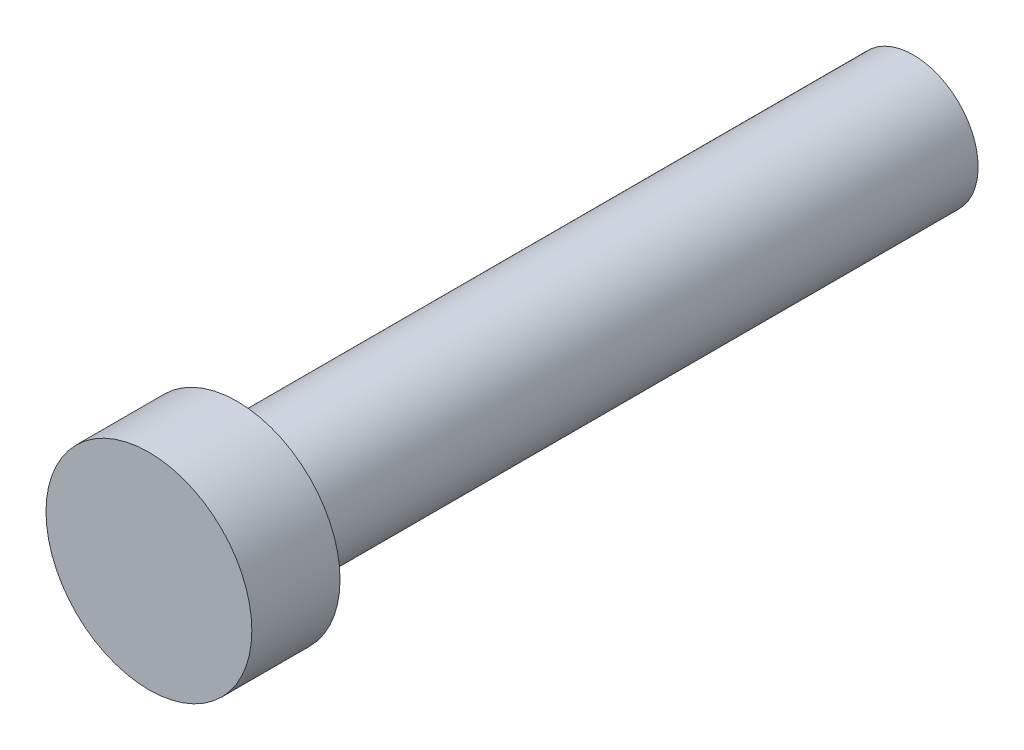
ISO-10303-21;
HEADER;
FILE_DESCRIPTION(('STEP AP214'),'2;1');
FILE_NAME('part.step','',(''),(''),'','','');
FILE_SCHEMA(('AUTOMOTIVE_DESIGN { 1 0 10303 214 1 1 1 1 }'));
ENDSEC;
DATA;
#1=APPLICATION_CONTEXT('core data for automotive mechanical design processes');
#2=APPLICATION_PROTOCOL_DEFINITION('international standard','automotive_design',2000,#1);
#3=PRODUCT_CONTEXT('',#1,'mechanical');
#4=PRODUCT('Part','Part','',(#3));
#5=PRODUCT_RELATED_PRODUCT_CATEGORY('part','',(#4));
#6=PRODUCT_DEFINITION_FORMATION('','',#4);
#7=PRODUCT_DEFINITION_CONTEXT('part definition',#1,'design');
#8=PRODUCT_DEFINITION('design','',#6,#7);
#9=PRODUCT_DEFINITION_SHAPE('','',#8);
#10=(LENGTH_UNIT() NAMED_UNIT(*) SI_UNIT(.MILLI.,.METRE.));
#11=(NAMED_UNIT(*) PLANE_ANGLE_UNIT() SI_UNIT($,.RADIAN.));
#12=(NAMED_UNIT(*) SI_UNIT($,.STERADIAN.) SOLID_ANGLE_UNIT());
#13=UNCERTAINTY_MEASURE_WITH_UNIT(LENGTH_MEASURE(1.E-05),#10,'distance_accuracy_value','');
#14=(GEOMETRIC_REPRESENTATION_CONTEXT(3) GLOBAL_UNCERTAINTY_ASSIGNED_CONTEXT((#13)) GLOBAL_UNIT_ASSIGNED_CONTEXT((#10,
#11,#12)) REPRESENTATION_CONTEXT('',''));
#15=CARTESIAN_POINT('',(0.,0.,0.));
#16=DIRECTION('',(0.,0.,1.));
#17=DIRECTION('',(1.,0.,0.));
#18=AXIS2_PLACEMENT_3D('',#15,#16,#17);
#19=CARTESIAN_POINT('',(0.,0.,26.));
#20=DIRECTION('',(0.,0.,-1.));
#21=DIRECTION('',(-1.,0.,0.));
#22=AXIS2_PLACEMENT_3D('',#19,#20,#21);
#23=CYLINDRICAL_SURFACE('',#22,2.2);
#24=CARTESIAN_POINT('',(0.,0.,0.));
#25=DIRECTION('',(0.,0.,1.));
#26=DIRECTION('',(1.,0.,0.));
#27=AXIS2_PLACEMENT_3D('',#24,#25,#26);
#28=CIRCLE('',#27,2.2);
#29=CARTESIAN_POINT('',(-2.2,0.,0.));
#30=VERTEX_POINT('',#29);
#31=EDGE_CURVE('E38',#30,#30,#28,.T.);
#32=CARTESIAN_POINT('',(0.,0.,23.));
#33=DIRECTION('',(0.,0.,1.));
#34=DIRECTION('',(1.,0.,0.));
#35=AXIS2_PLACEMENT_3D('',#32,#33,#34);
#36=CIRCLE('',#35,2.2);
#37=CARTESIAN_POINT('',(-2.2,0.,23.));
#38=VERTEX_POINT('',#37);
#39=EDGE_CURVE('E10',#38,#38,#36,.T.);
#40=CARTESIAN_POINT('',(-2.2,0.,0.));
#41=CARTESIAN_POINT('',(-2.2,0.,0.239583333333334));
#42=CARTESIAN_POINT('',(-2.2,0.,0.479166666666667));
#43=CARTESIAN_POINT('',(-2.2,0.,0.958333333333334));
#44=CARTESIAN_POINT('',(-2.2,0.,1.19791666666667));
#45=CARTESIAN_POINT('',(-2.2,0.,1.67708333333333));
#46=CARTESIAN_POINT('',(-2.2,0.,1.91666666666667));
#47=CARTESIAN_POINT('',(-2.2,0.,2.39583333333333));
#48=CARTESIAN_POINT('',(-2.2,0.,2.63541666666667));
#49=CARTESIAN_POINT('',(-2.2,0.,3.11458333333333));
#50=CARTESIAN_POINT('',(-2.2,0.,3.35416666666667));
#51=CARTESIAN_POINT('',(-2.2,0.,3.83333333333333));
#52=CARTESIAN_POINT('',(-2.2,0.,4.07291666666667));
#53=CARTESIAN_POINT('',(-2.2,0.,4.55208333333333));
#54=CARTESIAN_POINT('',(-2.2,0.,4.79166666666667));
#55=CARTESIAN_POINT('',(-2.2,0.,5.27083333333333));
#56=CARTESIAN_POINT('',(-2.2,0.,5.51041666666667));
#57=CARTESIAN_POINT('',(-2.2,0.,5.98958333333333));
#58=CARTESIAN_POINT('',(-2.2,0.,6.22916666666667));
#59=CARTESIAN_POINT('',(-2.2,0.,6.70833333333333));
#60=CARTESIAN_POINT('',(-2.2,0.,6.94791666666667));
#61=CARTESIAN_POINT('',(-2.2,0.,7.42708333333333));
#62=CARTESIAN_POINT('',(-2.2,0.,7.66666666666667));
#63=CARTESIAN_POINT('',(-2.2,0.,8.14583333333333));
#64=CARTESIAN_POINT('',(-2.2,0.,8.38541666666667));
#65=CARTESIAN_POINT('',(-2.2,0.,8.86458333333333));
#66=CARTESIAN_POINT('',(-2.2,0.,9.10416666666666));
#67=CARTESIAN_POINT('',(-2.2,0.,9.58333333333333));
#68=CARTESIAN_POINT('',(-2.2,0.,9.82291666666667));
#69=CARTESIAN_POINT('',(-2.2,0.,10.3020833333333));
#70=CARTESIAN_POINT('',(-2.2,0.,10.5416666666667));
#71=CARTESIAN_POINT('',(-2.2,0.,11.0208333333333));
#72=CARTESIAN_POINT('',(-2.2,0.,11.2604166666667));
#73=CARTESIAN_POINT('',(-2.2,0.,11.7395833333333));
#74=CARTESIAN_POINT('',(-2.2,0.,11.9791666666667));
#75=CARTESIAN_POINT('',(-2.2,0.,12.4583333333333));
#76=CARTESIAN_POINT('',(-2.2,0.,12.6979166666667));
#77=CARTESIAN_POINT('',(-2.2,0.,13.1770833333333));
#78=CARTESIAN_POINT('',(-2.2,0.,13.4166666666667));
#79=CARTESIAN_POINT('',(-2.2,0.,13.8958333333333));
#80=CARTESIAN_POINT('',(-2.2,0.,14.1354166666667));
#81=CARTESIAN_POINT('',(-2.2,0.,14.6145833333333));
#82=CARTESIAN_POINT('',(-2.2,0.,14.8541666666667));
#83=CARTESIAN_POINT('',(-2.2,0.,15.3333333333333));
#84=CARTESIAN_POINT('',(-2.2,0.,15.5729166666667));
#85=CARTESIAN_POINT('',(-2.2,0.,16.0520833333333));
#86=CARTESIAN_POINT('',(-2.2,0.,16.2916666666667));
#87=CARTESIAN_POINT('',(-2.2,0.,16.7708333333333));
#88=CARTESIAN_POINT('',(-2.2,0.,17.0104166666667));
#89=CARTESIAN_POINT('',(-2.2,0.,17.4895833333333));
#90=CARTESIAN_POINT('',(-2.2,0.,17.7291666666667));
#91=CARTESIAN_POINT('',(-2.2,0.,18.2083333333333));
#92=CARTESIAN_POINT('',(-2.2,0.,18.4479166666667));
#93=CARTESIAN_POINT('',(-2.2,0.,18.9270833333333));
#94=CARTESIAN_POINT('',(-2.2,0.,19.1666666666667));
#95=CARTESIAN_POINT('',(-2.2,0.,19.6458333333333));
#96=CARTESIAN_POINT('',(-2.2,0.,19.8854166666667));
#97=CARTESIAN_POINT('',(-2.2,0.,20.3645833333333));
#98=CARTESIAN_POINT('',(-2.2,0.,20.6041666666667));
#99=CARTESIAN_POINT('',(-2.2,0.,21.0833333333333));
#100=CARTESIAN_POINT('',(-2.2,0.,21.3229166666667));
#101=CARTESIAN_POINT('',(-2.2,0.,21.8020833333333));
#102=CARTESIAN_POINT('',(-2.2,0.,22.0416666666667));
#103=CARTESIAN_POINT('',(-2.2,0.,22.5208333333333));
#104=CARTESIAN_POINT('',(-2.2,0.,22.7604166666667));
#105=CARTESIAN_POINT('',(-2.2,0.,23.));
#106=B_SPLINE_CURVE_WITH_KNOTS('',3,(#40,#41,#42,#43,#44,#45,#46,#47,#48,#49,#50,#51,#52,#53,
#54,#55,#56,#57,#58,#59,#60,#61,#62,#63,#64,#65,#66,#67,#68,#69,#70,#71,#72,#73,#74,#75,#76,#77,
#78,#79,#80,#81,#82,#83,#84,#85,#86,#87,#88,#89,#90,#91,#92,#93,#94,#95,#96,#97,#98,#99,#100,
#101,#102,#103,#104,#105),.UNSPECIFIED.,.F.,.F.,(4,2,2,2,2,2,2,2,2,2,2,2,2,2,2,2,2,2,2,2,2,2,2,
2,2,2,2,2,2,2,2,2,4),(0.,0.718750000000001,1.4375,2.15625,2.875,3.59375,4.3125,5.03125,5.75,
6.46875,7.1875,7.90625,8.625,9.34375,10.0625,10.78125,11.5,12.21875,12.9375,13.65625,14.375,
15.09375,15.8125,16.53125,17.25,17.96875,18.6875,19.40625,20.125,20.84375,21.5625,22.28125,23.),.UNSPECIFIED.);
#107=EDGE_CURVE('BSEAM32',#30,#38,#106,.T.);
#108=ORIENTED_EDGE('',*,*,#31,.T.);
#109=ORIENTED_EDGE('',*,*,#39,.F.);
#110=ORIENTED_EDGE('',*,*,#107,.T.);
#111=ORIENTED_EDGE('',*,*,#107,.F.);
#112=EDGE_LOOP('',(#108,#110,#109,#111));
#113=FACE_BOUND('',#112,.T.);
#114=ADVANCED_FACE('F32',(#113),#23,.T.);
#115=CARTESIAN_POINT('',(0.,0.,0.));
#116=DIRECTION('',(0.,0.,1.));
#117=DIRECTION('',(1.,0.,0.));
#118=AXIS2_PLACEMENT_3D('',#115,#116,#117);
#119=PLANE('',#118);
#120=CARTESIAN_POINT('',(0.,0.,0.));
#121=DIRECTION('',(0.,0.,-1.));
#122=DIRECTION('',(-1.,0.,0.));
#123=AXIS2_PLACEMENT_3D('',#120,#121,#122);
#124=CIRCLE('',#123,1.);
#125=CARTESIAN_POINT('',(-1.,0.,0.));
#126=VERTEX_POINT('',#125);
#127=EDGE_CURVE('E52',#126,#126,#124,.T.);
#128=ORIENTED_EDGE('',*,*,#127,.F.);
#129=EDGE_LOOP('',(#128));
#130=FACE_BOUND('',#129,.T.);
#131=ORIENTED_EDGE('',*,*,#31,.F.);
#132=EDGE_LOOP('',(#131));
#133=FACE_BOUND('',#132,.T.);
#134=ADVANCED_FACE('F67',(#130,#133),#119,.F.);
#135=CARTESIAN_POINT('',(0.,0.,23.));
#136=DIRECTION('',(0.,0.,1.));
#137=DIRECTION('',(1.,0.,0.));
#138=AXIS2_PLACEMENT_3D('',#135,#136,#137);
#139=CYLINDRICAL_SURFACE('',#138,3.5);
#140=CARTESIAN_POINT('',(0.,0.,23.));
#141=DIRECTION('',(0.,0.,1.));
#142=DIRECTION('',(1.,0.,0.));
#143=AXIS2_PLACEMENT_3D('',#140,#141,#142);
#144=CIRCLE('',#143,3.5);
#145=CARTESIAN_POINT('',(3.5,0.,23.));
#146=VERTEX_POINT('',#145);
#147=EDGE_CURVE('E42',#146,#146,#144,.T.);
#148=ORIENTED_EDGE('',*,*,#147,.T.);
#149=EDGE_LOOP('',(#148));
#150=FACE_BOUND('',#149,.T.);
#151=CARTESIAN_POINT('',(0.,0.,26.));
#152=DIRECTION('',(0.,0.,1.));
#153=DIRECTION('',(1.,0.,0.));
#154=AXIS2_PLACEMENT_3D('',#151,#152,#153);
#155=CIRCLE('',#154,3.5);
#156=CARTESIAN_POINT('',(3.5,0.,26.));
#157=VERTEX_POINT('',#156);
#158=EDGE_CURVE('E46',#157,#157,#155,.T.);
#159=ORIENTED_EDGE('',*,*,#158,.F.);
#160=EDGE_LOOP('',(#159));
#161=FACE_BOUND('',#160,.T.);
#162=ADVANCED_FACE('F70',(#150,#161),#139,.T.);
#163=CARTESIAN_POINT('',(0.,0.,23.));
#164=DIRECTION('',(0.,0.,1.));
#165=DIRECTION('',(1.,0.,0.));
#166=AXIS2_PLACEMENT_3D('',#163,#164,#165);
#167=PLANE('',#166);
#168=ORIENTED_EDGE('',*,*,#39,.T.);
#169=EDGE_LOOP('',(#168));
#170=FACE_BOUND('',#169,.T.);
#171=ORIENTED_EDGE('',*,*,#147,.F.);
#172=EDGE_LOOP('',(#171));
#173=FACE_BOUND('',#172,.T.);
#174=ADVANCED_FACE('F75',(#170,#173),#167,.F.);
#175=CARTESIAN_POINT('',(0.,0.,26.));
#176=DIRECTION('',(0.,0.,1.));
#177=DIRECTION('',(1.,0.,0.));
#178=AXIS2_PLACEMENT_3D('',#175,#176,#177);
#179=PLANE('',#178);
#180=ORIENTED_EDGE('',*,*,#158,.T.);
#181=EDGE_LOOP('',(#180));
#182=FACE_BOUND('',#181,.T.);
#183=ADVANCED_FACE('F63',(#182),#179,.T.);
#184=CARTESIAN_POINT('',(0.,0.,5.));
#185=DIRECTION('',(0.,0.,-1.));
#186=DIRECTION('',(-1.,0.,0.));
#187=AXIS2_PLACEMENT_3D('',#184,#185,#186);
#188=CYLINDRICAL_SURFACE('',#187,1.);
#189=CARTESIAN_POINT('',(0.,0.,5.));
#190=DIRECTION('',(0.,0.,-1.));
#191=DIRECTION('',(-1.,0.,0.));
#192=AXIS2_PLACEMENT_3D('',#189,#190,#191);
#193=CIRCLE('',#192,1.);
#194=CARTESIAN_POINT('',(-1.,0.,5.));
#195=VERTEX_POINT('',#194);
#196=EDGE_CURVE('E50',#195,#195,#193,.T.);
#197=ORIENTED_EDGE('',*,*,#196,.F.);
#198=EDGE_LOOP('',(#197));
#199=FACE_BOUND('',#198,.T.);
#200=ORIENTED_EDGE('',*,*,#127,.T.);
#201=EDGE_LOOP('',(#200));
#202=FACE_BOUND('',#201,.T.);
#203=ADVANCED_FACE('F60',(#199,#202),#188,.F.);
#204=CARTESIAN_POINT('',(0.,0.,5.));
#205=DIRECTION('',(0.,0.,-1.));
#206=DIRECTION('',(-1.,0.,0.));
#207=AXIS2_PLACEMENT_3D('',#204,#205,#206);
#208=PLANE('',#207);
#209=ORIENTED_EDGE('',*,*,#196,.T.);
#210=EDGE_LOOP('',(#209));
#211=FACE_BOUND('',#210,.T.);
#212=ADVANCED_FACE('F58',(#211),#208,.T.);
#213=CLOSED_SHELL('',(#114,#134,#162,#174,#183,#203,#212));
#214=MANIFOLD_SOLID_BREP('B2',#213);
#215=ADVANCED_BREP_SHAPE_REPRESENTATION('',(#18,#214),#14);
#216=SHAPE_DEFINITION_REPRESENTATION(#9,#215);
ENDSEC;
END-ISO-10303-21;
